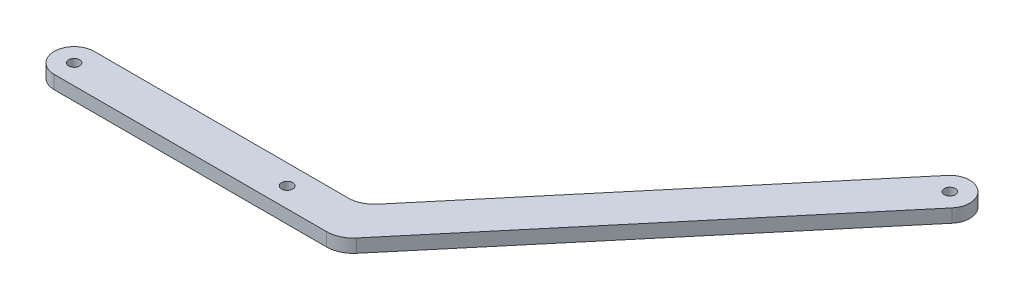
ISO-10303-21;
HEADER;
FILE_DESCRIPTION(('STEP AP214'),'2;1');
FILE_NAME('part.step','',(''),(''),'','','');
FILE_SCHEMA(('AUTOMOTIVE_DESIGN { 1 0 10303 214 1 1 1 1 }'));
ENDSEC;
DATA;
#1=APPLICATION_CONTEXT('core data for automotive mechanical design processes');
#2=APPLICATION_PROTOCOL_DEFINITION('international standard','automotive_design',2000,#1);
#3=PRODUCT_CONTEXT('',#1,'mechanical');
#4=PRODUCT('Part','Part','',(#3));
#5=PRODUCT_RELATED_PRODUCT_CATEGORY('part','',(#4));
#6=PRODUCT_DEFINITION_FORMATION('','',#4);
#7=PRODUCT_DEFINITION_CONTEXT('part definition',#1,'design');
#8=PRODUCT_DEFINITION('design','',#6,#7);
#9=PRODUCT_DEFINITION_SHAPE('','',#8);
#10=(LENGTH_UNIT() NAMED_UNIT(*) SI_UNIT(.MILLI.,.METRE.));
#11=(NAMED_UNIT(*) PLANE_ANGLE_UNIT() SI_UNIT($,.RADIAN.));
#12=(NAMED_UNIT(*) SI_UNIT($,.STERADIAN.) SOLID_ANGLE_UNIT());
#13=UNCERTAINTY_MEASURE_WITH_UNIT(LENGTH_MEASURE(1.E-05),#10,'distance_accuracy_value','');
#14=(GEOMETRIC_REPRESENTATION_CONTEXT(3) GLOBAL_UNCERTAINTY_ASSIGNED_CONTEXT((#13)) GLOBAL_UNIT_ASSIGNED_CONTEXT((#10,
#11,#12)) REPRESENTATION_CONTEXT('',''));
#15=CARTESIAN_POINT('',(0.,0.,0.));
#16=DIRECTION('',(0.,0.,1.));
#17=DIRECTION('',(1.,0.,0.));
#18=AXIS2_PLACEMENT_3D('',#15,#16,#17);
#19=CARTESIAN_POINT('',(-62.6973314606742,6.35,-0.214044943820216));
#20=DIRECTION('',(0.,1.,0.));
#21=DIRECTION('',(0.,0.,1.));
#22=AXIS2_PLACEMENT_3D('',#19,#20,#21);
#23=PLANE('',#22);
#24=CARTESIAN_POINT('',(199.358214785658,6.35,-155.873707931816));
#25=DIRECTION('',(0.,1.,0.));
#26=DIRECTION('',(0.,0.,1.));
#27=AXIS2_PLACEMENT_3D('',#24,#25,#26);
#28=CIRCLE('',#27,2.60349999999999);
#29=CARTESIAN_POINT('',(199.358214785658,6.35,-153.270207931816));
#30=VERTEX_POINT('',#29);
#31=EDGE_CURVE('E188',#30,#30,#28,.T.);
#32=ORIENTED_EDGE('',*,*,#31,.F.);
#33=EDGE_LOOP('',(#32));
#34=FACE_BOUND('',#33,.T.);
#35=CARTESIAN_POINT('',(-62.6973314606742,6.35,-0.214044943820216));
#36=DIRECTION('',(0.,1.,0.));
#37=DIRECTION('',(0.,0.,1.));
#38=AXIS2_PLACEMENT_3D('',#35,#36,#37);
#39=CIRCLE('',#38,9.525);
#40=CARTESIAN_POINT('',(-62.6973314606742,6.35,-9.73904494382022));
#41=VERTEX_POINT('',#40);
#42=CARTESIAN_POINT('',(-62.6973314606742,6.35,9.31095505617978));
#43=VERTEX_POINT('',#42);
#44=EDGE_CURVE('E151',#41,#43,#39,.T.);
#45=ORIENTED_EDGE('',*,*,#44,.T.);
#46=DIRECTION('',(1.,0.,0.));
#47=VECTOR('',#46,1.);
#48=CARTESIAN_POINT('',(-62.6973314606742,6.35,9.31095505617978));
#49=LINE('',#48,#47);
#50=CARTESIAN_POINT('',(67.2637221686101,6.35,9.31095505617978));
#51=VERTEX_POINT('',#50);
#52=EDGE_CURVE('E99',#43,#51,#49,.T.);
#53=ORIENTED_EDGE('',*,*,#52,.T.);
#54=CARTESIAN_POINT('',(67.2637221686101,6.35,-3.38904494382022));
#55=DIRECTION('',(0.,1.,0.));
#56=DIRECTION('',(0.,0.,1.));
#57=AXIS2_PLACEMENT_3D('',#54,#55,#56);
#58=CIRCLE('',#57,12.7);
#59=CARTESIAN_POINT('',(76.9924865962211,6.35,4.7743576991988));
#60=VERTEX_POINT('',#59);
#61=EDGE_CURVE('E166',#51,#60,#58,.T.);
#62=ORIENTED_EDGE('',*,*,#61,.T.);
#63=DIRECTION('',(0.642787609686537,0.,-0.76604444311898));
#64=VECTOR('',#63,1.);
#65=CARTESIAN_POINT('',(206.654788106366,6.35,-149.751155949551));
#66=LINE('',#65,#64);
#67=CARTESIAN_POINT('',(206.654788106366,6.35,-149.751155949551));
#68=VERTEX_POINT('',#67);
#69=EDGE_CURVE('E179',#60,#68,#66,.T.);
#70=ORIENTED_EDGE('',*,*,#69,.T.);
#71=CARTESIAN_POINT('',(199.358214785658,6.35,-155.873707931816));
#72=DIRECTION('',(0.,1.,0.));
#73=DIRECTION('',(0.,0.,-1.));
#74=AXIS2_PLACEMENT_3D('',#71,#72,#73);
#75=CIRCLE('',#74,9.525);
#76=CARTESIAN_POINT('',(192.06164146495,6.35,-161.99625991408));
#77=VERTEX_POINT('',#76);
#78=EDGE_CURVE('E118',#68,#77,#75,.T.);
#79=ORIENTED_EDGE('',*,*,#78,.T.);
#80=DIRECTION('',(-0.642787609686537,0.,0.76604444311898));
#81=VECTOR('',#80,1.);
#82=CARTESIAN_POINT('',(68.1093257083684,6.35,-14.2756423008012));
#83=LINE('',#82,#81);
#84=CARTESIAN_POINT('',(68.1093257083684,6.35,-14.2756423008012));
#85=VERTEX_POINT('',#84);
#86=EDGE_CURVE('E112',#77,#85,#83,.T.);
#87=ORIENTED_EDGE('',*,*,#86,.T.);
#88=CARTESIAN_POINT('',(58.3805612807573,6.35,-22.4390449438202));
#89=DIRECTION('',(0.,-1.,0.));
#90=DIRECTION('',(0.,0.,1.));
#91=AXIS2_PLACEMENT_3D('',#88,#89,#90);
#92=CIRCLE('',#91,12.7);
#93=CARTESIAN_POINT('',(58.3805612807573,6.35,-9.73904494382021));
#94=VERTEX_POINT('',#93);
#95=EDGE_CURVE('E116',#85,#94,#92,.T.);
#96=ORIENTED_EDGE('',*,*,#95,.T.);
#97=DIRECTION('',(-1.,0.,0.));
#98=VECTOR('',#97,1.);
#99=CARTESIAN_POINT('',(-62.6973314606742,6.35,-9.73904494382022));
#100=LINE('',#99,#98);
#101=EDGE_CURVE('E56',#94,#41,#100,.T.);
#102=ORIENTED_EDGE('',*,*,#101,.T.);
#103=EDGE_LOOP('',(#45,#53,#62,#70,#79,#87,#96,#102));
#104=FACE_BOUND('',#103,.T.);
#105=CARTESIAN_POINT('',(-62.6973314606742,6.35,-0.214044943820216));
#106=DIRECTION('',(0.,1.,0.));
#107=DIRECTION('',(0.,0.,1.));
#108=AXIS2_PLACEMENT_3D('',#105,#106,#107);
#109=CIRCLE('',#108,2.6035);
#110=CARTESIAN_POINT('',(-62.6973314606742,6.35,2.38945505617979));
#111=VERTEX_POINT('',#110);
#112=EDGE_CURVE('E140',#111,#111,#109,.T.);
#113=ORIENTED_EDGE('',*,*,#112,.F.);
#114=EDGE_LOOP('',(#113));
#115=FACE_BOUND('',#114,.T.);
#116=CARTESIAN_POINT('',(38.9026685393258,6.35,-0.214044943820216));
#117=DIRECTION('',(0.,1.,0.));
#118=DIRECTION('',(0.,0.,1.));
#119=AXIS2_PLACEMENT_3D('',#116,#117,#118);
#120=CIRCLE('',#119,2.667);
#121=CARTESIAN_POINT('',(38.9026685393258,6.35,2.45295505617979));
#122=VERTEX_POINT('',#121);
#123=EDGE_CURVE('E194',#122,#122,#120,.T.);
#124=ORIENTED_EDGE('',*,*,#123,.F.);
#125=EDGE_LOOP('',(#124));
#126=FACE_BOUND('',#125,.T.);
#127=ADVANCED_FACE('F39',(#34,#104,#115,#126),#23,.T.);
#128=CARTESIAN_POINT('',(-62.6973314606742,0.,-0.214044943820216));
#129=DIRECTION('',(0.,1.,0.));
#130=DIRECTION('',(0.,0.,1.));
#131=AXIS2_PLACEMENT_3D('',#128,#129,#130);
#132=PLANE('',#131);
#133=CARTESIAN_POINT('',(-62.6973314606742,0.,-0.214044943820216));
#134=DIRECTION('',(0.,1.,0.));
#135=DIRECTION('',(0.,0.,1.));
#136=AXIS2_PLACEMENT_3D('',#133,#134,#135);
#137=CIRCLE('',#136,9.525);
#138=CARTESIAN_POINT('',(-62.6973314606742,0.,-9.73904494382022));
#139=VERTEX_POINT('',#138);
#140=CARTESIAN_POINT('',(-62.6973314606742,0.,9.31095505617978));
#141=VERTEX_POINT('',#140);
#142=EDGE_CURVE('E136',#139,#141,#137,.T.);
#143=ORIENTED_EDGE('',*,*,#142,.F.);
#144=DIRECTION('',(-1.,0.,0.));
#145=VECTOR('',#144,1.);
#146=CARTESIAN_POINT('',(-62.6973314606742,0.,-9.73904494382022));
#147=LINE('',#146,#145);
#148=CARTESIAN_POINT('',(58.3805612807573,0.,-9.73904494382021));
#149=VERTEX_POINT('',#148);
#150=EDGE_CURVE('E91',#149,#139,#147,.T.);
#151=ORIENTED_EDGE('',*,*,#150,.F.);
#152=CARTESIAN_POINT('',(58.3805612807573,0.,-22.4390449438202));
#153=DIRECTION('',(0.,-1.,0.));
#154=DIRECTION('',(0.,0.,1.));
#155=AXIS2_PLACEMENT_3D('',#152,#153,#154);
#156=CIRCLE('',#155,12.7);
#157=CARTESIAN_POINT('',(68.1093257083684,0.,-14.2756423008012));
#158=VERTEX_POINT('',#157);
#159=EDGE_CURVE('E85',#158,#149,#156,.T.);
#160=ORIENTED_EDGE('',*,*,#159,.F.);
#161=DIRECTION('',(-0.642787609686537,0.,0.76604444311898));
#162=VECTOR('',#161,1.);
#163=CARTESIAN_POINT('',(68.1093257083684,0.,-14.2756423008012));
#164=LINE('',#163,#162);
#165=CARTESIAN_POINT('',(192.06164146495,0.,-161.99625991408));
#166=VERTEX_POINT('',#165);
#167=EDGE_CURVE('E126',#166,#158,#164,.T.);
#168=ORIENTED_EDGE('',*,*,#167,.F.);
#169=CARTESIAN_POINT('',(199.358214785658,0.,-155.873707931816));
#170=DIRECTION('',(0.,1.,0.));
#171=DIRECTION('',(0.,0.,-1.));
#172=AXIS2_PLACEMENT_3D('',#169,#170,#171);
#173=CIRCLE('',#172,9.525);
#174=CARTESIAN_POINT('',(206.654788106366,0.,-149.751155949551));
#175=VERTEX_POINT('',#174);
#176=EDGE_CURVE('E146',#175,#166,#173,.T.);
#177=ORIENTED_EDGE('',*,*,#176,.F.);
#178=DIRECTION('',(0.642787609686537,0.,-0.76604444311898));
#179=VECTOR('',#178,1.);
#180=CARTESIAN_POINT('',(206.654788106366,0.,-149.751155949551));
#181=LINE('',#180,#179);
#182=CARTESIAN_POINT('',(76.9924865962211,0.,4.7743576991988));
#183=VERTEX_POINT('',#182);
#184=EDGE_CURVE('E144',#183,#175,#181,.T.);
#185=ORIENTED_EDGE('',*,*,#184,.F.);
#186=CARTESIAN_POINT('',(67.2637221686101,0.,-3.38904494382022));
#187=DIRECTION('',(0.,1.,0.));
#188=DIRECTION('',(0.,0.,1.));
#189=AXIS2_PLACEMENT_3D('',#186,#187,#188);
#190=CIRCLE('',#189,12.7);
#191=CARTESIAN_POINT('',(67.2637221686101,0.,9.31095505617978));
#192=VERTEX_POINT('',#191);
#193=EDGE_CURVE('E142',#192,#183,#190,.T.);
#194=ORIENTED_EDGE('',*,*,#193,.F.);
#195=DIRECTION('',(1.,0.,0.));
#196=VECTOR('',#195,1.);
#197=CARTESIAN_POINT('',(64.3026685393258,0.,9.31095505617978));
#198=LINE('',#197,#196);
#199=EDGE_CURVE('E139',#141,#192,#198,.T.);
#200=ORIENTED_EDGE('',*,*,#199,.F.);
#201=EDGE_LOOP('',(#143,#151,#160,#168,#177,#185,#194,#200));
#202=FACE_BOUND('',#201,.T.);
#203=CARTESIAN_POINT('',(-62.6973314606742,0.,-0.214044943820216));
#204=DIRECTION('',(0.,1.,0.));
#205=DIRECTION('',(0.,0.,1.));
#206=AXIS2_PLACEMENT_3D('',#203,#204,#205);
#207=CIRCLE('',#206,2.6035);
#208=CARTESIAN_POINT('',(-62.6973314606742,0.,2.38945505617979));
#209=VERTEX_POINT('',#208);
#210=EDGE_CURVE('E185',#209,#209,#207,.T.);
#211=ORIENTED_EDGE('',*,*,#210,.T.);
#212=EDGE_LOOP('',(#211));
#213=FACE_BOUND('',#212,.T.);
#214=CARTESIAN_POINT('',(199.358214785658,0.,-155.873707931816));
#215=DIRECTION('',(0.,1.,0.));
#216=DIRECTION('',(0.,0.,1.));
#217=AXIS2_PLACEMENT_3D('',#214,#215,#216);
#218=CIRCLE('',#217,2.60349999999999);
#219=CARTESIAN_POINT('',(199.358214785658,0.,-153.270207931816));
#220=VERTEX_POINT('',#219);
#221=EDGE_CURVE('E191',#220,#220,#218,.T.);
#222=ORIENTED_EDGE('',*,*,#221,.T.);
#223=EDGE_LOOP('',(#222));
#224=FACE_BOUND('',#223,.T.);
#225=CARTESIAN_POINT('',(38.9026685393258,0.,-0.214044943820216));
#226=DIRECTION('',(0.,1.,0.));
#227=DIRECTION('',(0.,0.,1.));
#228=AXIS2_PLACEMENT_3D('',#225,#226,#227);
#229=CIRCLE('',#228,2.667);
#230=CARTESIAN_POINT('',(38.9026685393258,0.,2.45295505617979));
#231=VERTEX_POINT('',#230);
#232=EDGE_CURVE('E197',#231,#231,#229,.T.);
#233=ORIENTED_EDGE('',*,*,#232,.T.);
#234=EDGE_LOOP('',(#233));
#235=FACE_BOUND('',#234,.T.);
#236=ADVANCED_FACE('F170',(#202,#213,#224,#235),#132,.F.);
#237=CARTESIAN_POINT('',(-62.6973314606742,6.35,-0.214044943820216));
#238=DIRECTION('',(0.,-1.,0.));
#239=DIRECTION('',(0.,0.,-1.));
#240=AXIS2_PLACEMENT_3D('',#237,#238,#239);
#241=CYLINDRICAL_SURFACE('',#240,9.525);
#242=ORIENTED_EDGE('',*,*,#142,.T.);
#243=DIRECTION('',(0.,-1.,0.));
#244=VECTOR('',#243,1.);
#245=CARTESIAN_POINT('',(-62.6973314606742,6.35,9.31095505617978));
#246=LINE('',#245,#244);
#247=EDGE_CURVE('E11',#43,#141,#246,.T.);
#248=ORIENTED_EDGE('',*,*,#247,.F.);
#249=ORIENTED_EDGE('',*,*,#44,.F.);
#250=DIRECTION('',(0.,-1.,0.));
#251=VECTOR('',#250,1.);
#252=CARTESIAN_POINT('',(-62.6973314606742,6.35,-9.73904494382022));
#253=LINE('',#252,#251);
#254=EDGE_CURVE('E132',#41,#139,#253,.T.);
#255=ORIENTED_EDGE('',*,*,#254,.T.);
#256=EDGE_LOOP('',(#242,#248,#249,#255));
#257=FACE_BOUND('',#256,.T.);
#258=ADVANCED_FACE('F41',(#257),#241,.T.);
#259=CARTESIAN_POINT('',(64.3026685393258,6.35,9.31095505617978));
#260=DIRECTION('',(0.,0.,-1.));
#261=DIRECTION('',(-1.,0.,0.));
#262=AXIS2_PLACEMENT_3D('',#259,#260,#261);
#263=PLANE('',#262);
#264=ORIENTED_EDGE('',*,*,#199,.T.);
#265=DIRECTION('',(0.,-1.,0.));
#266=VECTOR('',#265,1.);
#267=CARTESIAN_POINT('',(67.2637221686101,6.35,9.31095505617978));
#268=LINE('',#267,#266);
#269=EDGE_CURVE('E48',#51,#192,#268,.T.);
#270=ORIENTED_EDGE('',*,*,#269,.F.);
#271=ORIENTED_EDGE('',*,*,#52,.F.);
#272=ORIENTED_EDGE('',*,*,#247,.T.);
#273=EDGE_LOOP('',(#264,#270,#271,#272));
#274=FACE_BOUND('',#273,.T.);
#275=ADVANCED_FACE('F230',(#274),#263,.F.);
#276=CARTESIAN_POINT('',(67.2637221686101,6.35,-3.38904494382022));
#277=DIRECTION('',(0.,-1.,0.));
#278=DIRECTION('',(0.,0.,-1.));
#279=AXIS2_PLACEMENT_3D('',#276,#277,#278);
#280=CYLINDRICAL_SURFACE('',#279,12.7);
#281=ORIENTED_EDGE('',*,*,#193,.T.);
#282=DIRECTION('',(0.,-1.,0.));
#283=VECTOR('',#282,1.);
#284=CARTESIAN_POINT('',(76.9924865962211,6.35,4.7743576991988));
#285=LINE('',#284,#283);
#286=EDGE_CURVE('E158',#60,#183,#285,.T.);
#287=ORIENTED_EDGE('',*,*,#286,.F.);
#288=ORIENTED_EDGE('',*,*,#61,.F.);
#289=ORIENTED_EDGE('',*,*,#269,.T.);
#290=EDGE_LOOP('',(#281,#287,#288,#289));
#291=FACE_BOUND('',#290,.T.);
#292=ADVANCED_FACE('F164',(#291),#280,.T.);
#293=CARTESIAN_POINT('',(206.654788106366,6.35,-149.751155949551));
#294=DIRECTION('',(-0.76604444311898,0.,-0.642787609686537));
#295=DIRECTION('',(-0.642787609686537,0.,0.76604444311898));
#296=AXIS2_PLACEMENT_3D('',#293,#294,#295);
#297=PLANE('',#296);
#298=ORIENTED_EDGE('',*,*,#184,.T.);
#299=DIRECTION('',(0.,-1.,0.));
#300=VECTOR('',#299,1.);
#301=CARTESIAN_POINT('',(206.654788106366,6.35,-149.751155949551));
#302=LINE('',#301,#300);
#303=EDGE_CURVE('E155',#68,#175,#302,.T.);
#304=ORIENTED_EDGE('',*,*,#303,.F.);
#305=ORIENTED_EDGE('',*,*,#69,.F.);
#306=ORIENTED_EDGE('',*,*,#286,.T.);
#307=EDGE_LOOP('',(#298,#304,#305,#306));
#308=FACE_BOUND('',#307,.T.);
#309=ADVANCED_FACE('F175',(#308),#297,.F.);
#310=CARTESIAN_POINT('',(199.358214785658,6.35,-155.873707931816));
#311=DIRECTION('',(0.,-1.,0.));
#312=DIRECTION('',(0.,0.,-1.));
#313=AXIS2_PLACEMENT_3D('',#310,#311,#312);
#314=CYLINDRICAL_SURFACE('',#313,9.525);
#315=ORIENTED_EDGE('',*,*,#176,.T.);
#316=DIRECTION('',(0.,-1.,0.));
#317=VECTOR('',#316,1.);
#318=CARTESIAN_POINT('',(192.06164146495,6.35,-161.99625991408));
#319=LINE('',#318,#317);
#320=EDGE_CURVE('E127',#77,#166,#319,.T.);
#321=ORIENTED_EDGE('',*,*,#320,.F.);
#322=ORIENTED_EDGE('',*,*,#78,.F.);
#323=ORIENTED_EDGE('',*,*,#303,.T.);
#324=EDGE_LOOP('',(#315,#321,#322,#323));
#325=FACE_BOUND('',#324,.T.);
#326=ADVANCED_FACE('F178',(#325),#314,.T.);
#327=CARTESIAN_POINT('',(68.1093257083684,6.35,-14.2756423008012));
#328=DIRECTION('',(0.76604444311898,0.,0.642787609686537));
#329=DIRECTION('',(0.642787609686537,0.,-0.76604444311898));
#330=AXIS2_PLACEMENT_3D('',#327,#328,#329);
#331=PLANE('',#330);
#332=ORIENTED_EDGE('',*,*,#167,.T.);
#333=DIRECTION('',(0.,-1.,0.));
#334=VECTOR('',#333,1.);
#335=CARTESIAN_POINT('',(68.1093257083684,6.35,-14.2756423008012));
#336=LINE('',#335,#334);
#337=EDGE_CURVE('E123',#85,#158,#336,.T.);
#338=ORIENTED_EDGE('',*,*,#337,.F.);
#339=ORIENTED_EDGE('',*,*,#86,.F.);
#340=ORIENTED_EDGE('',*,*,#320,.T.);
#341=EDGE_LOOP('',(#332,#338,#339,#340));
#342=FACE_BOUND('',#341,.T.);
#343=ADVANCED_FACE('F124',(#342),#331,.F.);
#344=CARTESIAN_POINT('',(58.3805612807573,6.35,-22.4390449438202));
#345=DIRECTION('',(0.,-1.,0.));
#346=DIRECTION('',(0.,0.,-1.));
#347=AXIS2_PLACEMENT_3D('',#344,#345,#346);
#348=CYLINDRICAL_SURFACE('',#347,12.7);
#349=ORIENTED_EDGE('',*,*,#159,.T.);
#350=DIRECTION('',(0.,-1.,0.));
#351=VECTOR('',#350,1.);
#352=CARTESIAN_POINT('',(58.3805612807573,6.35,-9.73904494382021));
#353=LINE('',#352,#351);
#354=EDGE_CURVE('E128',#94,#149,#353,.T.);
#355=ORIENTED_EDGE('',*,*,#354,.F.);
#356=ORIENTED_EDGE('',*,*,#95,.F.);
#357=ORIENTED_EDGE('',*,*,#337,.T.);
#358=EDGE_LOOP('',(#349,#355,#356,#357));
#359=FACE_BOUND('',#358,.T.);
#360=ADVANCED_FACE('F130',(#359),#348,.F.);
#361=CARTESIAN_POINT('',(-62.6973314606742,6.35,-9.73904494382022));
#362=DIRECTION('',(0.,0.,1.));
#363=DIRECTION('',(1.,0.,0.));
#364=AXIS2_PLACEMENT_3D('',#361,#362,#363);
#365=PLANE('',#364);
#366=ORIENTED_EDGE('',*,*,#150,.T.);
#367=ORIENTED_EDGE('',*,*,#254,.F.);
#368=ORIENTED_EDGE('',*,*,#101,.F.);
#369=ORIENTED_EDGE('',*,*,#354,.T.);
#370=EDGE_LOOP('',(#366,#367,#368,#369));
#371=FACE_BOUND('',#370,.T.);
#372=ADVANCED_FACE('F218',(#371),#365,.F.);
#373=CARTESIAN_POINT('',(-62.6973314606742,6.35,-0.214044943820216));
#374=DIRECTION('',(0.,-1.,0.));
#375=DIRECTION('',(0.,0.,-1.));
#376=AXIS2_PLACEMENT_3D('',#373,#374,#375);
#377=CYLINDRICAL_SURFACE('',#376,2.6035);
#378=ORIENTED_EDGE('',*,*,#112,.T.);
#379=EDGE_LOOP('',(#378));
#380=FACE_BOUND('',#379,.T.);
#381=ORIENTED_EDGE('',*,*,#210,.F.);
#382=EDGE_LOOP('',(#381));
#383=FACE_BOUND('',#382,.T.);
#384=ADVANCED_FACE('F215',(#380,#383),#377,.F.);
#385=CARTESIAN_POINT('',(199.358214785658,6.35,-155.873707931816));
#386=DIRECTION('',(0.,-1.,0.));
#387=DIRECTION('',(0.,0.,-1.));
#388=AXIS2_PLACEMENT_3D('',#385,#386,#387);
#389=CYLINDRICAL_SURFACE('',#388,2.60349999999999);
#390=ORIENTED_EDGE('',*,*,#31,.T.);
#391=EDGE_LOOP('',(#390));
#392=FACE_BOUND('',#391,.T.);
#393=ORIENTED_EDGE('',*,*,#221,.F.);
#394=EDGE_LOOP('',(#393));
#395=FACE_BOUND('',#394,.T.);
#396=ADVANCED_FACE('F297',(#392,#395),#389,.F.);
#397=CARTESIAN_POINT('',(38.9026685393258,6.35,-0.214044943820216));
#398=DIRECTION('',(0.,-1.,0.));
#399=DIRECTION('',(0.,0.,-1.));
#400=AXIS2_PLACEMENT_3D('',#397,#398,#399);
#401=CYLINDRICAL_SURFACE('',#400,2.667);
#402=ORIENTED_EDGE('',*,*,#123,.T.);
#403=EDGE_LOOP('',(#402));
#404=FACE_BOUND('',#403,.T.);
#405=ORIENTED_EDGE('',*,*,#232,.F.);
#406=EDGE_LOOP('',(#405));
#407=FACE_BOUND('',#406,.T.);
#408=ADVANCED_FACE('F203',(#404,#407),#401,.F.);
#409=CLOSED_SHELL('',(#127,#236,#258,#275,#292,#309,#326,#343,#360,#372,#384,#396,#408));
#410=MANIFOLD_SOLID_BREP('B2',#409);
#411=ADVANCED_BREP_SHAPE_REPRESENTATION('',(#18,#410),#14);
#412=SHAPE_DEFINITION_REPRESENTATION(#9,#411);
ENDSEC;
END-ISO-10303-21;
